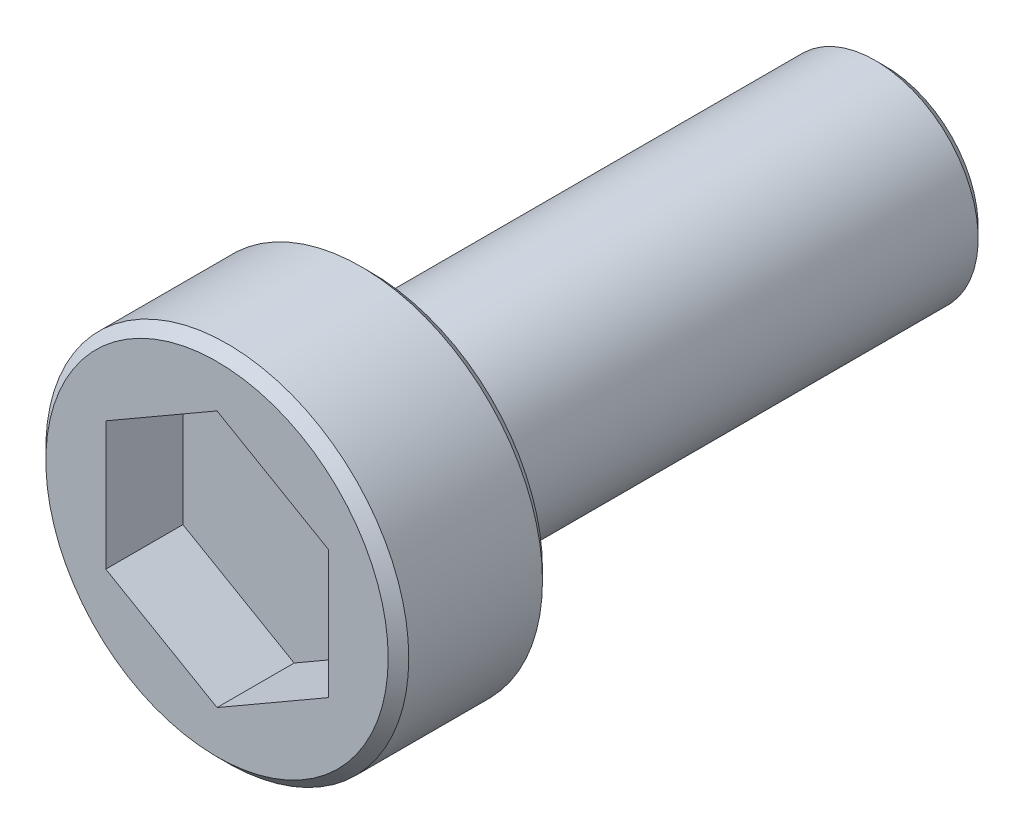
ISO-10303-21;
HEADER;
FILE_DESCRIPTION(('STEP AP214'),'2;1');
FILE_NAME('part.step','',(''),(''),'','','');
FILE_SCHEMA(('AUTOMOTIVE_DESIGN { 1 0 10303 214 1 1 1 1 }'));
ENDSEC;
DATA;
#1=APPLICATION_CONTEXT('core data for automotive mechanical design processes');
#2=APPLICATION_PROTOCOL_DEFINITION('international standard','automotive_design',2000,#1);
#3=PRODUCT_CONTEXT('',#1,'mechanical');
#4=PRODUCT('Part','Part','',(#3));
#5=PRODUCT_RELATED_PRODUCT_CATEGORY('part','',(#4));
#6=PRODUCT_DEFINITION_FORMATION('','',#4);
#7=PRODUCT_DEFINITION_CONTEXT('part definition',#1,'design');
#8=PRODUCT_DEFINITION('design','',#6,#7);
#9=PRODUCT_DEFINITION_SHAPE('','',#8);
#10=(LENGTH_UNIT() NAMED_UNIT(*) SI_UNIT(.MILLI.,.METRE.));
#11=(NAMED_UNIT(*) PLANE_ANGLE_UNIT() SI_UNIT($,.RADIAN.));
#12=(NAMED_UNIT(*) SI_UNIT($,.STERADIAN.) SOLID_ANGLE_UNIT());
#13=UNCERTAINTY_MEASURE_WITH_UNIT(LENGTH_MEASURE(1.E-05),#10,'distance_accuracy_value','');
#14=(GEOMETRIC_REPRESENTATION_CONTEXT(3) GLOBAL_UNCERTAINTY_ASSIGNED_CONTEXT((#13)) GLOBAL_UNIT_ASSIGNED_CONTEXT((#10,
#11,#12)) REPRESENTATION_CONTEXT('',''));
#15=CARTESIAN_POINT('',(0.,0.,0.));
#16=DIRECTION('',(0.,0.,1.));
#17=DIRECTION('',(1.,0.,0.));
#18=AXIS2_PLACEMENT_3D('',#15,#16,#17);
#19=CARTESIAN_POINT('',(0.,0.,16.));
#20=DIRECTION('',(0.,0.,-1.));
#21=DIRECTION('',(-1.,0.,0.));
#22=AXIS2_PLACEMENT_3D('',#19,#20,#21);
#23=CYLINDRICAL_SURFACE('',#22,2.);
#24=CARTESIAN_POINT('',(0.,0.,6.2));
#25=DIRECTION('',(0.,0.,-1.));
#26=DIRECTION('',(-1.,0.,0.));
#27=AXIS2_PLACEMENT_3D('',#24,#25,#26);
#28=CIRCLE('',#27,2.);
#29=CARTESIAN_POINT('',(-2.,0.,6.2));
#30=VERTEX_POINT('',#29);
#31=EDGE_CURVE('E11',#30,#30,#28,.F.);
#32=ORIENTED_EDGE('',*,*,#31,.T.);
#33=EDGE_LOOP('',(#32));
#34=FACE_BOUND('',#33,.T.);
#35=CARTESIAN_POINT('',(0.,0.,16.));
#36=DIRECTION('',(0.,0.,1.));
#37=DIRECTION('',(1.,0.,0.));
#38=AXIS2_PLACEMENT_3D('',#35,#36,#37);
#39=CIRCLE('',#38,2.);
#40=CARTESIAN_POINT('',(2.,0.,16.));
#41=VERTEX_POINT('',#40);
#42=EDGE_CURVE('E143',#41,#41,#39,.T.);
#43=ORIENTED_EDGE('',*,*,#42,.F.);
#44=EDGE_LOOP('',(#43));
#45=FACE_BOUND('',#44,.T.);
#46=ADVANCED_FACE('F41',(#34,#45),#23,.T.);
#47=CARTESIAN_POINT('',(0.,0.,19.));
#48=DIRECTION('',(0.,0.,-1.));
#49=DIRECTION('',(-1.,0.,0.));
#50=AXIS2_PLACEMENT_3D('',#47,#48,#49);
#51=CYLINDRICAL_SURFACE('',#50,3.52854216956388);
#52=CARTESIAN_POINT('',(0.,0.,18.8));
#53=DIRECTION('',(0.,0.,1.));
#54=DIRECTION('',(1.,0.,0.));
#55=AXIS2_PLACEMENT_3D('',#52,#53,#54);
#56=CIRCLE('',#55,3.52854216956388);
#57=CARTESIAN_POINT('',(3.52854216956388,0.,18.8));
#58=VERTEX_POINT('',#57);
#59=EDGE_CURVE('E157',#58,#58,#56,.F.);
#60=ORIENTED_EDGE('',*,*,#59,.T.);
#61=EDGE_LOOP('',(#60));
#62=FACE_BOUND('',#61,.T.);
#63=CARTESIAN_POINT('',(0.,0.,16.2));
#64=DIRECTION('',(0.,0.,1.));
#65=DIRECTION('',(1.,0.,0.));
#66=AXIS2_PLACEMENT_3D('',#63,#64,#65);
#67=CIRCLE('',#66,3.52854216956388);
#68=CARTESIAN_POINT('',(3.52854216956388,0.,16.2));
#69=VERTEX_POINT('',#68);
#70=EDGE_CURVE('E154',#69,#69,#67,.T.);
#71=ORIENTED_EDGE('',*,*,#70,.T.);
#72=EDGE_LOOP('',(#71));
#73=FACE_BOUND('',#72,.T.);
#74=ADVANCED_FACE('F176',(#62,#73),#51,.T.);
#75=CARTESIAN_POINT('',(0.,0.,19.));
#76=DIRECTION('',(0.,0.,1.));
#77=DIRECTION('',(1.,0.,0.));
#78=AXIS2_PLACEMENT_3D('',#75,#76,#77);
#79=PLANE('',#78);
#80=CARTESIAN_POINT('',(0.,0.,19.));
#81=DIRECTION('',(0.,0.,1.));
#82=DIRECTION('',(1.,0.,0.));
#83=AXIS2_PLACEMENT_3D('',#80,#81,#82);
#84=CIRCLE('',#83,3.32854216956388);
#85=CARTESIAN_POINT('',(3.32854216956388,0.,19.));
#86=VERTEX_POINT('',#85);
#87=EDGE_CURVE('E151',#86,#86,#84,.T.);
#88=ORIENTED_EDGE('',*,*,#87,.T.);
#89=EDGE_LOOP('',(#88));
#90=FACE_BOUND('',#89,.T.);
#91=DIRECTION('',(-0.866025403784441,0.499999999999995,0.));
#92=VECTOR('',#91,1.);
#93=CARTESIAN_POINT('',(2.16306090746615,1.24884379719917,19.));
#94=LINE('',#93,#92);
#95=CARTESIAN_POINT('',(2.16306090746615,1.24884379719917,19.));
#96=VERTEX_POINT('',#95);
#97=CARTESIAN_POINT('',(0.,2.49768759439829,19.));
#98=VERTEX_POINT('',#97);
#99=EDGE_CURVE('E56',#96,#98,#94,.T.);
#100=ORIENTED_EDGE('',*,*,#99,.F.);
#101=DIRECTION('',(0.,1.,0.));
#102=VECTOR('',#101,1.);
#103=CARTESIAN_POINT('',(2.16306090746617,-1.24884379719912,19.));
#104=LINE('',#103,#102);
#105=CARTESIAN_POINT('',(2.16306090746617,-1.24884379719912,19.));
#106=VERTEX_POINT('',#105);
#107=EDGE_CURVE('E139',#106,#96,#104,.T.);
#108=ORIENTED_EDGE('',*,*,#107,.F.);
#109=DIRECTION('',(0.866025403784435,0.500000000000007,0.));
#110=VECTOR('',#109,1.);
#111=CARTESIAN_POINT('',(0.,-2.49768759439829,19.));
#112=LINE('',#111,#110);
#113=CARTESIAN_POINT('',(0.,-2.49768759439829,19.));
#114=VERTEX_POINT('',#113);
#115=EDGE_CURVE('E137',#114,#106,#112,.T.);
#116=ORIENTED_EDGE('',*,*,#115,.F.);
#117=DIRECTION('',(0.866025403784442,-0.499999999999995,0.));
#118=VECTOR('',#117,1.);
#119=CARTESIAN_POINT('',(-2.16306090746615,-1.24884379719915,19.));
#120=LINE('',#119,#118);
#121=CARTESIAN_POINT('',(-2.16306090746615,-1.24884379719915,19.));
#122=VERTEX_POINT('',#121);
#123=EDGE_CURVE('E104',#122,#114,#120,.T.);
#124=ORIENTED_EDGE('',*,*,#123,.F.);
#125=DIRECTION('',(0.,-1.,0.));
#126=VECTOR('',#125,1.);
#127=CARTESIAN_POINT('',(-2.16306090746616,1.24884379719914,19.));
#128=LINE('',#127,#126);
#129=CARTESIAN_POINT('',(-2.16306090746616,1.24884379719914,19.));
#130=VERTEX_POINT('',#129);
#131=EDGE_CURVE('E133',#130,#122,#128,.T.);
#132=ORIENTED_EDGE('',*,*,#131,.F.);
#133=DIRECTION('',(-0.866025403784438,-0.500000000000001,0.));
#134=VECTOR('',#133,1.);
#135=CARTESIAN_POINT('',(0.,2.49768759439829,19.));
#136=LINE('',#135,#134);
#137=EDGE_CURVE('E130',#98,#130,#136,.T.);
#138=ORIENTED_EDGE('',*,*,#137,.F.);
#139=EDGE_LOOP('',(#100,#108,#116,#124,#132,#138));
#140=FACE_BOUND('',#139,.T.);
#141=ADVANCED_FACE('F182',(#90,#140),#79,.T.);
#142=CARTESIAN_POINT('',(0.,0.,16.));
#143=DIRECTION('',(0.,0.,1.));
#144=DIRECTION('',(1.,0.,0.));
#145=AXIS2_PLACEMENT_3D('',#142,#143,#144);
#146=PLANE('',#145);
#147=CARTESIAN_POINT('',(0.,0.,16.));
#148=DIRECTION('',(0.,0.,1.));
#149=DIRECTION('',(1.,0.,0.));
#150=AXIS2_PLACEMENT_3D('',#147,#148,#149);
#151=CIRCLE('',#150,3.32854216956388);
#152=CARTESIAN_POINT('',(3.32854216956388,0.,16.));
#153=VERTEX_POINT('',#152);
#154=EDGE_CURVE('E160',#153,#153,#151,.F.);
#155=ORIENTED_EDGE('',*,*,#154,.T.);
#156=EDGE_LOOP('',(#155));
#157=FACE_BOUND('',#156,.T.);
#158=ORIENTED_EDGE('',*,*,#42,.T.);
#159=EDGE_LOOP('',(#158));
#160=FACE_BOUND('',#159,.T.);
#161=ADVANCED_FACE('F200',(#157,#160),#146,.F.);
#162=CARTESIAN_POINT('',(2.16306090746615,1.24884379719917,17.5));
#163=DIRECTION('',(0.499999999999995,0.866025403784442,0.));
#164=DIRECTION('',(-0.866025403784442,0.499999999999995,0.));
#165=AXIS2_PLACEMENT_3D('',#162,#163,#164);
#166=PLANE('',#165);
#167=ORIENTED_EDGE('',*,*,#99,.T.);
#168=DIRECTION('',(0.,0.,1.));
#169=VECTOR('',#168,1.);
#170=CARTESIAN_POINT('',(0.,2.49768759439829,17.5));
#171=LINE('',#170,#169);
#172=CARTESIAN_POINT('',(0.,2.49768759439829,17.5));
#173=VERTEX_POINT('',#172);
#174=EDGE_CURVE('E86',#173,#98,#171,.T.);
#175=ORIENTED_EDGE('',*,*,#174,.F.);
#176=DIRECTION('',(-0.866025403784441,0.499999999999995,0.));
#177=VECTOR('',#176,1.);
#178=CARTESIAN_POINT('',(2.16306090746615,1.24884379719917,17.5));
#179=LINE('',#178,#177);
#180=CARTESIAN_POINT('',(2.16306090746615,1.24884379719917,17.5));
#181=VERTEX_POINT('',#180);
#182=EDGE_CURVE('E141',#181,#173,#179,.T.);
#183=ORIENTED_EDGE('',*,*,#182,.F.);
#184=DIRECTION('',(0.,0.,1.));
#185=VECTOR('',#184,1.);
#186=CARTESIAN_POINT('',(2.16306090746615,1.24884379719917,17.5));
#187=LINE('',#186,#185);
#188=EDGE_CURVE('E64',#181,#96,#187,.T.);
#189=ORIENTED_EDGE('',*,*,#188,.T.);
#190=EDGE_LOOP('',(#167,#175,#183,#189));
#191=FACE_BOUND('',#190,.T.);
#192=ADVANCED_FACE('F203',(#191),#166,.F.);
#193=CARTESIAN_POINT('',(2.16306090746617,-1.24884379719912,17.5));
#194=DIRECTION('',(1.,0.,0.));
#195=DIRECTION('',(0.,1.,0.));
#196=AXIS2_PLACEMENT_3D('',#193,#194,#195);
#197=PLANE('',#196);
#198=ORIENTED_EDGE('',*,*,#107,.T.);
#199=ORIENTED_EDGE('',*,*,#188,.F.);
#200=DIRECTION('',(0.,1.,0.));
#201=VECTOR('',#200,1.);
#202=CARTESIAN_POINT('',(2.16306090746617,-1.24884379719912,17.5));
#203=LINE('',#202,#201);
#204=CARTESIAN_POINT('',(2.16306090746617,-1.24884379719912,17.5));
#205=VERTEX_POINT('',#204);
#206=EDGE_CURVE('E116',#205,#181,#203,.T.);
#207=ORIENTED_EDGE('',*,*,#206,.F.);
#208=DIRECTION('',(0.,0.,1.));
#209=VECTOR('',#208,1.);
#210=CARTESIAN_POINT('',(2.16306090746617,-1.24884379719912,17.5));
#211=LINE('',#210,#209);
#212=EDGE_CURVE('E108',#205,#106,#211,.T.);
#213=ORIENTED_EDGE('',*,*,#212,.T.);
#214=EDGE_LOOP('',(#198,#199,#207,#213));
#215=FACE_BOUND('',#214,.T.);
#216=ADVANCED_FACE('F209',(#215),#197,.F.);
#217=CARTESIAN_POINT('',(0.,-2.49768759439829,17.5));
#218=DIRECTION('',(0.500000000000007,-0.866025403784434,0.));
#219=DIRECTION('',(0.866025403784435,0.500000000000007,0.));
#220=AXIS2_PLACEMENT_3D('',#217,#218,#219);
#221=PLANE('',#220);
#222=ORIENTED_EDGE('',*,*,#115,.T.);
#223=ORIENTED_EDGE('',*,*,#212,.F.);
#224=DIRECTION('',(0.866025403784435,0.500000000000007,0.));
#225=VECTOR('',#224,1.);
#226=CARTESIAN_POINT('',(0.,-2.49768759439829,17.5));
#227=LINE('',#226,#225);
#228=CARTESIAN_POINT('',(0.,-2.49768759439829,17.5));
#229=VERTEX_POINT('',#228);
#230=EDGE_CURVE('E112',#229,#205,#227,.T.);
#231=ORIENTED_EDGE('',*,*,#230,.F.);
#232=DIRECTION('',(0.,0.,1.));
#233=VECTOR('',#232,1.);
#234=CARTESIAN_POINT('',(0.,-2.49768759439829,17.5));
#235=LINE('',#234,#233);
#236=EDGE_CURVE('E97',#229,#114,#235,.T.);
#237=ORIENTED_EDGE('',*,*,#236,.T.);
#238=EDGE_LOOP('',(#222,#223,#231,#237));
#239=FACE_BOUND('',#238,.T.);
#240=ADVANCED_FACE('F113',(#239),#221,.F.);
#241=CARTESIAN_POINT('',(-2.16306090746615,-1.24884379719915,17.5));
#242=DIRECTION('',(-0.499999999999995,-0.866025403784441,0.));
#243=DIRECTION('',(0.866025403784442,-0.499999999999995,0.));
#244=AXIS2_PLACEMENT_3D('',#241,#242,#243);
#245=PLANE('',#244);
#246=ORIENTED_EDGE('',*,*,#123,.T.);
#247=ORIENTED_EDGE('',*,*,#236,.F.);
#248=DIRECTION('',(0.866025403784442,-0.499999999999995,0.));
#249=VECTOR('',#248,1.);
#250=CARTESIAN_POINT('',(-2.16306090746615,-1.24884379719915,17.5));
#251=LINE('',#250,#249);
#252=CARTESIAN_POINT('',(-2.16306090746615,-1.24884379719915,17.5));
#253=VERTEX_POINT('',#252);
#254=EDGE_CURVE('E101',#253,#229,#251,.T.);
#255=ORIENTED_EDGE('',*,*,#254,.F.);
#256=DIRECTION('',(0.,0.,1.));
#257=VECTOR('',#256,1.);
#258=CARTESIAN_POINT('',(-2.16306090746615,-1.24884379719915,17.5));
#259=LINE('',#258,#257);
#260=EDGE_CURVE('E109',#253,#122,#259,.T.);
#261=ORIENTED_EDGE('',*,*,#260,.T.);
#262=EDGE_LOOP('',(#246,#247,#255,#261));
#263=FACE_BOUND('',#262,.T.);
#264=ADVANCED_FACE('F99',(#263),#245,.F.);
#265=CARTESIAN_POINT('',(-2.16306090746616,1.24884379719914,17.5));
#266=DIRECTION('',(-1.,0.,0.));
#267=DIRECTION('',(0.,-1.,0.));
#268=AXIS2_PLACEMENT_3D('',#265,#266,#267);
#269=PLANE('',#268);
#270=ORIENTED_EDGE('',*,*,#131,.T.);
#271=ORIENTED_EDGE('',*,*,#260,.F.);
#272=DIRECTION('',(0.,-1.,0.));
#273=VECTOR('',#272,1.);
#274=CARTESIAN_POINT('',(-2.16306090746616,1.24884379719914,17.5));
#275=LINE('',#274,#273);
#276=CARTESIAN_POINT('',(-2.16306090746616,1.24884379719914,17.5));
#277=VERTEX_POINT('',#276);
#278=EDGE_CURVE('E122',#277,#253,#275,.T.);
#279=ORIENTED_EDGE('',*,*,#278,.F.);
#280=DIRECTION('',(0.,0.,1.));
#281=VECTOR('',#280,1.);
#282=CARTESIAN_POINT('',(-2.16306090746616,1.24884379719914,17.5));
#283=LINE('',#282,#281);
#284=EDGE_CURVE('E146',#277,#130,#283,.T.);
#285=ORIENTED_EDGE('',*,*,#284,.T.);
#286=EDGE_LOOP('',(#270,#271,#279,#285));
#287=FACE_BOUND('',#286,.T.);
#288=ADVANCED_FACE('F217',(#287),#269,.F.);
#289=CARTESIAN_POINT('',(0.,2.49768759439829,17.5));
#290=DIRECTION('',(-0.500000000000001,0.866025403784438,0.));
#291=DIRECTION('',(-0.866025403784438,-0.500000000000001,0.));
#292=AXIS2_PLACEMENT_3D('',#289,#290,#291);
#293=PLANE('',#292);
#294=ORIENTED_EDGE('',*,*,#137,.T.);
#295=ORIENTED_EDGE('',*,*,#284,.F.);
#296=DIRECTION('',(-0.866025403784438,-0.500000000000001,0.));
#297=VECTOR('',#296,1.);
#298=CARTESIAN_POINT('',(0.,2.49768759439829,17.5));
#299=LINE('',#298,#297);
#300=EDGE_CURVE('E124',#173,#277,#299,.T.);
#301=ORIENTED_EDGE('',*,*,#300,.F.);
#302=ORIENTED_EDGE('',*,*,#174,.T.);
#303=EDGE_LOOP('',(#294,#295,#301,#302));
#304=FACE_BOUND('',#303,.T.);
#305=ADVANCED_FACE('F214',(#304),#293,.F.);
#306=CARTESIAN_POINT('',(0.,0.,17.5));
#307=DIRECTION('',(0.,0.,1.));
#308=DIRECTION('',(1.,0.,0.));
#309=AXIS2_PLACEMENT_3D('',#306,#307,#308);
#310=PLANE('',#309);
#311=ORIENTED_EDGE('',*,*,#182,.T.);
#312=ORIENTED_EDGE('',*,*,#300,.T.);
#313=ORIENTED_EDGE('',*,*,#278,.T.);
#314=ORIENTED_EDGE('',*,*,#254,.T.);
#315=ORIENTED_EDGE('',*,*,#230,.T.);
#316=ORIENTED_EDGE('',*,*,#206,.T.);
#317=EDGE_LOOP('',(#311,#312,#313,#314,#315,#316));
#318=FACE_BOUND('',#317,.T.);
#319=ADVANCED_FACE('F119',(#318),#310,.T.);
#320=CARTESIAN_POINT('',(0.,0.,19.));
#321=DIRECTION('',(0.,0.,-1.));
#322=DIRECTION('',(-1.,0.,0.));
#323=AXIS2_PLACEMENT_3D('',#320,#321,#322);
#324=CONICAL_SURFACE('',#323,3.32854216956388,0.785398163397436);
#325=ORIENTED_EDGE('',*,*,#59,.F.);
#326=EDGE_LOOP('',(#325));
#327=FACE_BOUND('',#326,.T.);
#328=ORIENTED_EDGE('',*,*,#87,.F.);
#329=EDGE_LOOP('',(#328));
#330=FACE_BOUND('',#329,.T.);
#331=ADVANCED_FACE('F188',(#327,#330),#324,.T.);
#332=CARTESIAN_POINT('',(0.,0.,16.2));
#333=DIRECTION('',(0.,0.,1.));
#334=DIRECTION('',(1.,0.,0.));
#335=AXIS2_PLACEMENT_3D('',#332,#333,#334);
#336=CONICAL_SURFACE('',#335,3.52854216956388,0.785398163397446);
#337=ORIENTED_EDGE('',*,*,#154,.F.);
#338=EDGE_LOOP('',(#337));
#339=FACE_BOUND('',#338,.T.);
#340=ORIENTED_EDGE('',*,*,#70,.F.);
#341=EDGE_LOOP('',(#340));
#342=FACE_BOUND('',#341,.T.);
#343=ADVANCED_FACE('F172',(#339,#342),#336,.T.);
#344=CARTESIAN_POINT('',(0.,0.,6.));
#345=DIRECTION('',(0.,0.,-1.));
#346=DIRECTION('',(-1.,0.,0.));
#347=AXIS2_PLACEMENT_3D('',#344,#345,#346);
#348=PLANE('',#347);
#349=CARTESIAN_POINT('',(0.,0.,6.));
#350=DIRECTION('',(0.,0.,-1.));
#351=DIRECTION('',(-1.,0.,0.));
#352=AXIS2_PLACEMENT_3D('',#349,#350,#351);
#353=CIRCLE('',#352,1.8);
#354=CARTESIAN_POINT('',(-1.8,0.,6.));
#355=VERTEX_POINT('',#354);
#356=EDGE_CURVE('E49',#355,#355,#353,.T.);
#357=ORIENTED_EDGE('',*,*,#356,.T.);
#358=EDGE_LOOP('',(#357));
#359=FACE_BOUND('',#358,.T.);
#360=ADVANCED_FACE('F165',(#359),#348,.T.);
#361=CARTESIAN_POINT('',(0.,0.,6.));
#362=DIRECTION('',(0.,0.,1.));
#363=DIRECTION('',(1.,0.,0.));
#364=AXIS2_PLACEMENT_3D('',#361,#362,#363);
#365=CONICAL_SURFACE('',#364,1.8,0.785398163397444);
#366=ORIENTED_EDGE('',*,*,#31,.F.);
#367=EDGE_LOOP('',(#366));
#368=FACE_BOUND('',#367,.T.);
#369=ORIENTED_EDGE('',*,*,#356,.F.);
#370=EDGE_LOOP('',(#369));
#371=FACE_BOUND('',#370,.T.);
#372=ADVANCED_FACE('F43',(#368,#371),#365,.T.);
#373=CLOSED_SHELL('',(#46,#74,#141,#161,#192,#216,#240,#264,#288,#305,#319,#331,#343,#360,#372));
#374=MANIFOLD_SOLID_BREP('B2',#373);
#375=ADVANCED_BREP_SHAPE_REPRESENTATION('',(#18,#374),#14);
#376=SHAPE_DEFINITION_REPRESENTATION(#9,#375);
ENDSEC;
END-ISO-10303-21;
